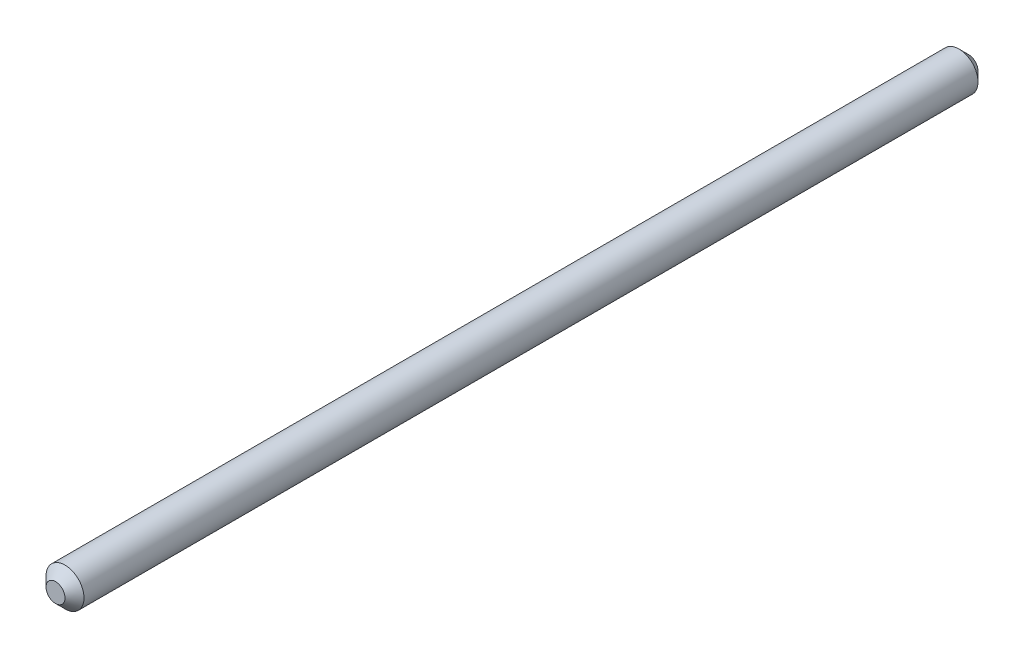
ISO-10303-21;
HEADER;
FILE_DESCRIPTION(('STEP AP214'),'2;1');
FILE_NAME('part.step','',(''),(''),'','','');
FILE_SCHEMA(('AUTOMOTIVE_DESIGN { 1 0 10303 214 1 1 1 1 }'));
ENDSEC;
DATA;
#1=APPLICATION_CONTEXT('core data for automotive mechanical design processes');
#2=APPLICATION_PROTOCOL_DEFINITION('international standard','automotive_design',2000,#1);
#3=PRODUCT_CONTEXT('',#1,'mechanical');
#4=PRODUCT('Part','Part','',(#3));
#5=PRODUCT_RELATED_PRODUCT_CATEGORY('part','',(#4));
#6=PRODUCT_DEFINITION_FORMATION('','',#4);
#7=PRODUCT_DEFINITION_CONTEXT('part definition',#1,'design');
#8=PRODUCT_DEFINITION('design','',#6,#7);
#9=PRODUCT_DEFINITION_SHAPE('','',#8);
#10=(LENGTH_UNIT() NAMED_UNIT(*) SI_UNIT(.MILLI.,.METRE.));
#11=(NAMED_UNIT(*) PLANE_ANGLE_UNIT() SI_UNIT($,.RADIAN.));
#12=(NAMED_UNIT(*) SI_UNIT($,.STERADIAN.) SOLID_ANGLE_UNIT());
#13=UNCERTAINTY_MEASURE_WITH_UNIT(LENGTH_MEASURE(1.E-05),#10,'distance_accuracy_value','');
#14=(GEOMETRIC_REPRESENTATION_CONTEXT(3) GLOBAL_UNCERTAINTY_ASSIGNED_CONTEXT((#13)) GLOBAL_UNIT_ASSIGNED_CONTEXT((#10,
#11,#12)) REPRESENTATION_CONTEXT('',''));
#15=CARTESIAN_POINT('',(0.,0.,0.));
#16=DIRECTION('',(0.,0.,1.));
#17=DIRECTION('',(1.,0.,0.));
#18=AXIS2_PLACEMENT_3D('',#15,#16,#17);
#19=CARTESIAN_POINT('',(0.,0.,-48.));
#20=DIRECTION('',(0.,0.,1.));
#21=DIRECTION('',(1.,0.,0.));
#22=AXIS2_PLACEMENT_3D('',#19,#20,#21);
#23=CYLINDRICAL_SURFACE('',#22,1.);
#24=CARTESIAN_POINT('',(0.,0.,-47.5));
#25=DIRECTION('',(0.,0.,1.));
#26=DIRECTION('',(1.,0.,0.));
#27=AXIS2_PLACEMENT_3D('',#24,#25,#26);
#28=CIRCLE('',#27,1.);
#29=CARTESIAN_POINT('',(1.,0.,-47.5));
#30=VERTEX_POINT('',#29);
#31=EDGE_CURVE('E53',#30,#30,#28,.T.);
#32=ORIENTED_EDGE('',*,*,#31,.T.);
#33=EDGE_LOOP('',(#32));
#34=FACE_BOUND('',#33,.T.);
#35=CARTESIAN_POINT('',(0.,0.,-0.499999999999994));
#36=DIRECTION('',(0.,0.,1.));
#37=DIRECTION('',(1.,0.,0.));
#38=AXIS2_PLACEMENT_3D('',#35,#36,#37);
#39=CIRCLE('',#38,1.);
#40=CARTESIAN_POINT('',(1.,0.,-0.499999999999994));
#41=VERTEX_POINT('',#40);
#42=EDGE_CURVE('E58',#41,#41,#39,.F.);
#43=ORIENTED_EDGE('',*,*,#42,.T.);
#44=EDGE_LOOP('',(#43));
#45=FACE_BOUND('',#44,.T.);
#46=ADVANCED_FACE('F39',(#34,#45),#23,.T.);
#47=CARTESIAN_POINT('',(0.,0.,-48.));
#48=DIRECTION('',(0.,0.,1.));
#49=DIRECTION('',(1.,0.,0.));
#50=AXIS2_PLACEMENT_3D('',#47,#48,#49);
#51=PLANE('',#50);
#52=CARTESIAN_POINT('',(0.,0.,-48.));
#53=DIRECTION('',(0.,0.,1.));
#54=DIRECTION('',(1.,0.,0.));
#55=AXIS2_PLACEMENT_3D('',#52,#53,#54);
#56=CIRCLE('',#55,0.500000000000007);
#57=CARTESIAN_POINT('',(0.500000000000007,0.,-48.));
#58=VERTEX_POINT('',#57);
#59=EDGE_CURVE('E48',#58,#58,#56,.F.);
#60=ORIENTED_EDGE('',*,*,#59,.T.);
#61=EDGE_LOOP('',(#60));
#62=FACE_BOUND('',#61,.T.);
#63=ADVANCED_FACE('F75',(#62),#51,.F.);
#64=CARTESIAN_POINT('',(0.,0.,0.));
#65=DIRECTION('',(0.,0.,1.));
#66=DIRECTION('',(1.,0.,0.));
#67=AXIS2_PLACEMENT_3D('',#64,#65,#66);
#68=PLANE('',#67);
#69=CARTESIAN_POINT('',(0.,0.,0.));
#70=DIRECTION('',(0.,0.,1.));
#71=DIRECTION('',(1.,0.,0.));
#72=AXIS2_PLACEMENT_3D('',#69,#70,#71);
#73=CIRCLE('',#72,0.5);
#74=CARTESIAN_POINT('',(0.5,0.,0.));
#75=VERTEX_POINT('',#74);
#76=EDGE_CURVE('E10',#75,#75,#73,.T.);
#77=ORIENTED_EDGE('',*,*,#76,.T.);
#78=EDGE_LOOP('',(#77));
#79=FACE_BOUND('',#78,.T.);
#80=ADVANCED_FACE('F72',(#79),#68,.T.);
#81=CARTESIAN_POINT('',(0.,0.,-47.5));
#82=DIRECTION('',(0.,0.,1.));
#83=DIRECTION('',(1.,0.,0.));
#84=AXIS2_PLACEMENT_3D('',#81,#82,#83);
#85=CONICAL_SURFACE('',#84,1.,0.785398163397447);
#86=ORIENTED_EDGE('',*,*,#59,.F.);
#87=EDGE_LOOP('',(#86));
#88=FACE_BOUND('',#87,.T.);
#89=ORIENTED_EDGE('',*,*,#31,.F.);
#90=EDGE_LOOP('',(#89));
#91=FACE_BOUND('',#90,.T.);
#92=ADVANCED_FACE('F68',(#88,#91),#85,.T.);
#93=CARTESIAN_POINT('',(0.,0.,0.));
#94=DIRECTION('',(0.,0.,-1.));
#95=DIRECTION('',(-1.,0.,0.));
#96=AXIS2_PLACEMENT_3D('',#93,#94,#95);
#97=CONICAL_SURFACE('',#96,0.5,0.785398163397454);
#98=ORIENTED_EDGE('',*,*,#42,.F.);
#99=EDGE_LOOP('',(#98));
#100=FACE_BOUND('',#99,.T.);
#101=ORIENTED_EDGE('',*,*,#76,.F.);
#102=EDGE_LOOP('',(#101));
#103=FACE_BOUND('',#102,.T.);
#104=ADVANCED_FACE('F42',(#100,#103),#97,.T.);
#105=CLOSED_SHELL('',(#46,#63,#80,#92,#104));
#106=MANIFOLD_SOLID_BREP('B2',#105);
#107=ADVANCED_BREP_SHAPE_REPRESENTATION('',(#18,#106),#14);
#108=SHAPE_DEFINITION_REPRESENTATION(#9,#107);
ENDSEC;
END-ISO-10303-21;
